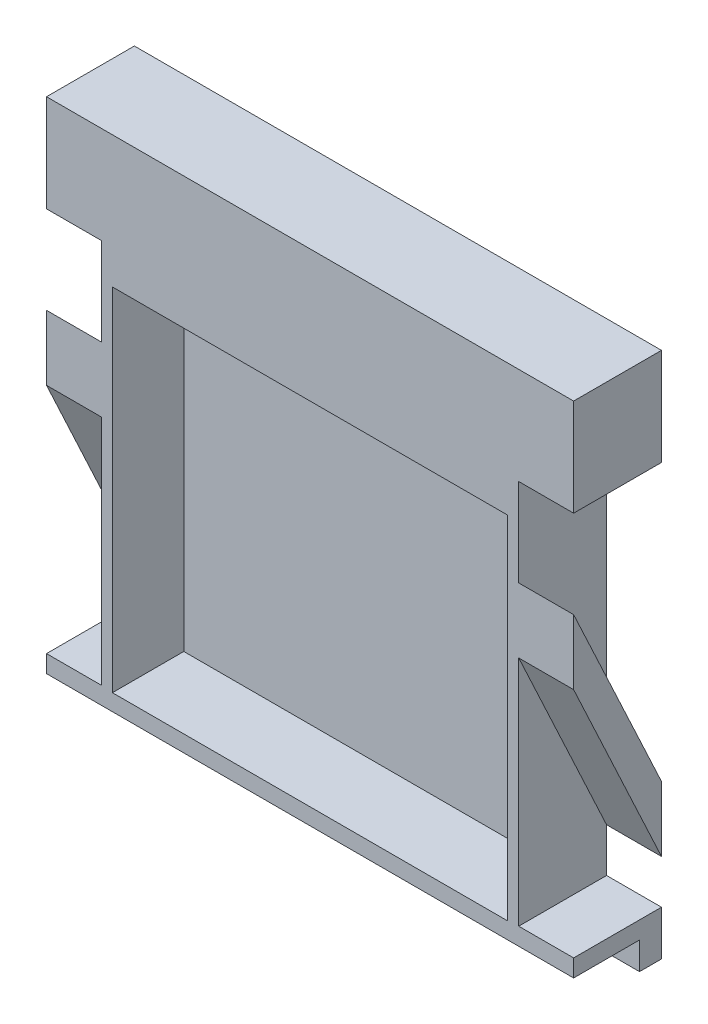
ISO-10303-21;
HEADER;
FILE_DESCRIPTION(('STEP AP214'),'2;1');
FILE_NAME('part.step','',(''),(''),'','','');
FILE_SCHEMA(('AUTOMOTIVE_DESIGN { 1 0 10303 214 1 1 1 1 }'));
ENDSEC;
DATA;
#1=APPLICATION_CONTEXT('core data for automotive mechanical design processes');
#2=APPLICATION_PROTOCOL_DEFINITION('international standard','automotive_design',2000,#1);
#3=PRODUCT_CONTEXT('',#1,'mechanical');
#4=PRODUCT('Part','Part','',(#3));
#5=PRODUCT_RELATED_PRODUCT_CATEGORY('part','',(#4));
#6=PRODUCT_DEFINITION_FORMATION('','',#4);
#7=PRODUCT_DEFINITION_CONTEXT('part definition',#1,'design');
#8=PRODUCT_DEFINITION('design','',#6,#7);
#9=PRODUCT_DEFINITION_SHAPE('','',#8);
#10=(LENGTH_UNIT() NAMED_UNIT(*) SI_UNIT(.MILLI.,.METRE.));
#11=(NAMED_UNIT(*) PLANE_ANGLE_UNIT() SI_UNIT($,.RADIAN.));
#12=(NAMED_UNIT(*) SI_UNIT($,.STERADIAN.) SOLID_ANGLE_UNIT());
#13=UNCERTAINTY_MEASURE_WITH_UNIT(LENGTH_MEASURE(1.E-05),#10,'distance_accuracy_value','');
#14=(GEOMETRIC_REPRESENTATION_CONTEXT(3) GLOBAL_UNCERTAINTY_ASSIGNED_CONTEXT((#13)) GLOBAL_UNIT_ASSIGNED_CONTEXT((#10,
#11,#12)) REPRESENTATION_CONTEXT('',''));
#15=CARTESIAN_POINT('',(0.,0.,0.));
#16=DIRECTION('',(0.,0.,1.));
#17=DIRECTION('',(1.,0.,0.));
#18=AXIS2_PLACEMENT_3D('',#15,#16,#17);
#19=CARTESIAN_POINT('',(-152.4,-152.4,50.8));
#20=DIRECTION('',(1.,0.,0.));
#21=DIRECTION('',(0.,0.,-1.));
#22=AXIS2_PLACEMENT_3D('',#19,#20,#21);
#23=PLANE('',#22);
#24=DIRECTION('',(0.,0.,-1.));
#25=VECTOR('',#24,1.);
#26=CARTESIAN_POINT('',(-152.4,-126.463450132546,0.));
#27=LINE('',#26,#25);
#28=CARTESIAN_POINT('',(-152.4,-126.463450132546,50.8));
#29=VERTEX_POINT('',#28);
#30=CARTESIAN_POINT('',(-152.4,-126.463450132546,0.));
#31=VERTEX_POINT('',#30);
#32=EDGE_CURVE('E223',#29,#31,#27,.T.);
#33=ORIENTED_EDGE('',*,*,#32,.T.);
#34=DIRECTION('',(0.,-1.,0.));
#35=VECTOR('',#34,1.);
#36=CARTESIAN_POINT('',(-152.4,-152.4,0.));
#37=LINE('',#36,#35);
#38=CARTESIAN_POINT('',(-152.4,-152.4,0.));
#39=VERTEX_POINT('',#38);
#40=EDGE_CURVE('E384',#31,#39,#37,.T.);
#41=ORIENTED_EDGE('',*,*,#40,.T.);
#42=DIRECTION('',(0.,0.,-1.));
#43=VECTOR('',#42,1.);
#44=CARTESIAN_POINT('',(-152.4,-152.4,50.8));
#45=LINE('',#44,#43);
#46=CARTESIAN_POINT('',(-152.4,-152.4,12.7));
#47=VERTEX_POINT('',#46);
#48=EDGE_CURVE('E11',#47,#39,#45,.T.);
#49=ORIENTED_EDGE('',*,*,#48,.F.);
#50=DIRECTION('',(0.,-1.,0.));
#51=VECTOR('',#50,1.);
#52=CARTESIAN_POINT('',(-152.4,-152.4,12.7));
#53=LINE('',#52,#51);
#54=CARTESIAN_POINT('',(-152.4,-136.525,12.7));
#55=VERTEX_POINT('',#54);
#56=EDGE_CURVE('E342',#55,#47,#53,.T.);
#57=ORIENTED_EDGE('',*,*,#56,.F.);
#58=DIRECTION('',(0.,0.,1.));
#59=VECTOR('',#58,1.);
#60=CARTESIAN_POINT('',(-152.4,-136.525,12.7));
#61=LINE('',#60,#59);
#62=CARTESIAN_POINT('',(-152.4,-136.525,50.8));
#63=VERTEX_POINT('',#62);
#64=EDGE_CURVE('E354',#55,#63,#61,.T.);
#65=ORIENTED_EDGE('',*,*,#64,.T.);
#66=DIRECTION('',(0.,-1.,0.));
#67=VECTOR('',#66,1.);
#68=CARTESIAN_POINT('',(-152.4,-152.4,50.8));
#69=LINE('',#68,#67);
#70=EDGE_CURVE('E395',#29,#63,#69,.T.);
#71=ORIENTED_EDGE('',*,*,#70,.F.);
#72=EDGE_LOOP('',(#33,#41,#49,#57,#65,#71));
#73=FACE_BOUND('',#72,.T.);
#74=ADVANCED_FACE('F35',(#73),#23,.F.);
#75=DIRECTION('',(0.,0.906307787036648,0.422618261740704));
#76=VECTOR('',#75,1.);
#77=CARTESIAN_POINT('',(-152.4,7.87750142933856,50.8));
#78=LINE('',#77,#76);
#79=CARTESIAN_POINT('',(-152.4,-101.063450132546,0.));
#80=VERTEX_POINT('',#79);
#81=CARTESIAN_POINT('',(-152.4,7.87750142933856,50.8));
#82=VERTEX_POINT('',#81);
#83=EDGE_CURVE('E507',#80,#82,#78,.T.);
#84=ORIENTED_EDGE('',*,*,#83,.T.);
#85=CARTESIAN_POINT('',(-152.4,45.440951561884,50.8));
#86=VERTEX_POINT('',#85);
#87=EDGE_CURVE('E229',#86,#82,#69,.T.);
#88=ORIENTED_EDGE('',*,*,#87,.F.);
#89=DIRECTION('',(0.,-0.906307787036648,-0.422618261740704));
#90=VECTOR('',#89,1.);
#91=CARTESIAN_POINT('',(-152.4,45.440951561884,50.8));
#92=LINE('',#91,#90);
#93=CARTESIAN_POINT('',(-152.4,-63.5000000000001,0.));
#94=VERTEX_POINT('',#93);
#95=EDGE_CURVE('E239',#86,#94,#92,.T.);
#96=ORIENTED_EDGE('',*,*,#95,.T.);
#97=EDGE_CURVE('E407',#94,#80,#37,.T.);
#98=ORIENTED_EDGE('',*,*,#97,.T.);
#99=EDGE_LOOP('',(#84,#88,#96,#98));
#100=FACE_BOUND('',#99,.T.);
#101=ADVANCED_FACE('F470',(#100),#23,.F.);
#102=CARTESIAN_POINT('',(-152.4,152.4,50.8));
#103=DIRECTION('',(0.,0.,-1.));
#104=DIRECTION('',(-1.,0.,0.));
#105=AXIS2_PLACEMENT_3D('',#102,#103,#104);
#106=PLANE('',#105);
#107=DIRECTION('',(-1.,0.,0.));
#108=VECTOR('',#107,1.);
#109=CARTESIAN_POINT('',(114.3,76.2,50.8));
#110=LINE('',#109,#108);
#111=CARTESIAN_POINT('',(114.3,76.2,50.8));
#112=VERTEX_POINT('',#111);
#113=CARTESIAN_POINT('',(-114.3,76.2,50.8));
#114=VERTEX_POINT('',#113);
#115=EDGE_CURVE('E374',#112,#114,#110,.T.);
#116=ORIENTED_EDGE('',*,*,#115,.F.);
#117=DIRECTION('',(0.,1.,0.));
#118=VECTOR('',#117,1.);
#119=CARTESIAN_POINT('',(114.3,-127.,50.8));
#120=LINE('',#119,#118);
#121=CARTESIAN_POINT('',(114.3,-127.,50.8));
#122=VERTEX_POINT('',#121);
#123=EDGE_CURVE('E357',#122,#112,#120,.T.);
#124=ORIENTED_EDGE('',*,*,#123,.F.);
#125=DIRECTION('',(1.,0.,0.));
#126=VECTOR('',#125,1.);
#127=CARTESIAN_POINT('',(114.3,-127.,50.8));
#128=LINE('',#127,#126);
#129=CARTESIAN_POINT('',(-114.3,-127.,50.8));
#130=VERTEX_POINT('',#129);
#131=EDGE_CURVE('E363',#130,#122,#128,.T.);
#132=ORIENTED_EDGE('',*,*,#131,.F.);
#133=DIRECTION('',(0.,-1.,0.));
#134=VECTOR('',#133,1.);
#135=CARTESIAN_POINT('',(-114.3,-127.,50.8));
#136=LINE('',#135,#134);
#137=EDGE_CURVE('E377',#114,#130,#136,.T.);
#138=ORIENTED_EDGE('',*,*,#137,.F.);
#139=EDGE_LOOP('',(#116,#124,#132,#138));
#140=FACE_BOUND('',#139,.T.);
#141=DIRECTION('',(-1.,0.,0.));
#142=VECTOR('',#141,1.);
#143=CARTESIAN_POINT('',(-120.65,-126.463450132546,50.8));
#144=LINE('',#143,#142);
#145=CARTESIAN_POINT('',(-120.65,-126.463450132546,50.8));
#146=VERTEX_POINT('',#145);
#147=EDGE_CURVE('E250',#146,#29,#144,.T.);
#148=ORIENTED_EDGE('',*,*,#147,.T.);
#149=ORIENTED_EDGE('',*,*,#70,.T.);
#150=DIRECTION('',(-1.,0.,0.));
#151=VECTOR('',#150,1.);
#152=CARTESIAN_POINT('',(-152.4,-136.525,50.8));
#153=LINE('',#152,#151);
#154=CARTESIAN_POINT('',(152.4,-136.525,50.8));
#155=VERTEX_POINT('',#154);
#156=EDGE_CURVE('E339',#155,#63,#153,.T.);
#157=ORIENTED_EDGE('',*,*,#156,.F.);
#158=DIRECTION('',(0.,1.,0.));
#159=VECTOR('',#158,1.);
#160=CARTESIAN_POINT('',(152.4,-152.4,50.8));
#161=LINE('',#160,#159);
#162=CARTESIAN_POINT('',(152.4,-126.463450132546,50.8));
#163=VERTEX_POINT('',#162);
#164=EDGE_CURVE('E396',#155,#163,#161,.T.);
#165=ORIENTED_EDGE('',*,*,#164,.T.);
#166=DIRECTION('',(1.,0.,0.));
#167=VECTOR('',#166,1.);
#168=CARTESIAN_POINT('',(120.65,-126.463450132546,50.8));
#169=LINE('',#168,#167);
#170=CARTESIAN_POINT('',(120.65,-126.463450132546,50.8));
#171=VERTEX_POINT('',#170);
#172=EDGE_CURVE('E273',#171,#163,#169,.T.);
#173=ORIENTED_EDGE('',*,*,#172,.F.);
#174=DIRECTION('',(0.,-1.,0.));
#175=VECTOR('',#174,1.);
#176=CARTESIAN_POINT('',(120.65,-126.463450132546,50.8));
#177=LINE('',#176,#175);
#178=CARTESIAN_POINT('',(120.65,7.87750142933856,50.8));
#179=VERTEX_POINT('',#178);
#180=EDGE_CURVE('E262',#179,#171,#177,.T.);
#181=ORIENTED_EDGE('',*,*,#180,.F.);
#182=DIRECTION('',(1.,0.,0.));
#183=VECTOR('',#182,1.);
#184=CARTESIAN_POINT('',(120.65,7.87750142933856,50.8));
#185=LINE('',#184,#183);
#186=CARTESIAN_POINT('',(152.4,7.87750142933856,50.8));
#187=VERTEX_POINT('',#186);
#188=EDGE_CURVE('E276',#179,#187,#185,.T.);
#189=ORIENTED_EDGE('',*,*,#188,.T.);
#190=CARTESIAN_POINT('',(152.4,45.440951561884,50.8));
#191=VERTEX_POINT('',#190);
#192=EDGE_CURVE('E400',#187,#191,#161,.T.);
#193=ORIENTED_EDGE('',*,*,#192,.T.);
#194=DIRECTION('',(1.,0.,0.));
#195=VECTOR('',#194,1.);
#196=CARTESIAN_POINT('',(120.65,45.440951561884,50.8));
#197=LINE('',#196,#195);
#198=CARTESIAN_POINT('',(120.65,45.440951561884,50.8));
#199=VERTEX_POINT('',#198);
#200=EDGE_CURVE('E297',#199,#191,#197,.T.);
#201=ORIENTED_EDGE('',*,*,#200,.F.);
#202=DIRECTION('',(0.,-1.,0.));
#203=VECTOR('',#202,1.);
#204=CARTESIAN_POINT('',(120.65,96.240951561884,50.8));
#205=LINE('',#204,#203);
#206=CARTESIAN_POINT('',(120.65,96.240951561884,50.8));
#207=VERTEX_POINT('',#206);
#208=EDGE_CURVE('E286',#207,#199,#205,.T.);
#209=ORIENTED_EDGE('',*,*,#208,.F.);
#210=DIRECTION('',(1.,0.,0.));
#211=VECTOR('',#210,1.);
#212=CARTESIAN_POINT('',(120.65,96.240951561884,50.8));
#213=LINE('',#212,#211);
#214=CARTESIAN_POINT('',(152.4,96.240951561884,50.8));
#215=VERTEX_POINT('',#214);
#216=EDGE_CURVE('E301',#207,#215,#213,.T.);
#217=ORIENTED_EDGE('',*,*,#216,.T.);
#218=CARTESIAN_POINT('',(152.4,152.4,50.8));
#219=VERTEX_POINT('',#218);
#220=EDGE_CURVE('E394',#215,#219,#161,.T.);
#221=ORIENTED_EDGE('',*,*,#220,.T.);
#222=DIRECTION('',(-1.,0.,0.));
#223=VECTOR('',#222,1.);
#224=CARTESIAN_POINT('',(-152.4,152.4,50.8));
#225=LINE('',#224,#223);
#226=CARTESIAN_POINT('',(-152.4,152.4,50.8));
#227=VERTEX_POINT('',#226);
#228=EDGE_CURVE('E399',#219,#227,#225,.T.);
#229=ORIENTED_EDGE('',*,*,#228,.T.);
#230=CARTESIAN_POINT('',(-152.4,96.240951561884,50.8));
#231=VERTEX_POINT('',#230);
#232=EDGE_CURVE('E391',#227,#231,#69,.T.);
#233=ORIENTED_EDGE('',*,*,#232,.T.);
#234=DIRECTION('',(-1.,0.,0.));
#235=VECTOR('',#234,1.);
#236=CARTESIAN_POINT('',(-120.65,96.240951561884,50.8));
#237=LINE('',#236,#235);
#238=CARTESIAN_POINT('',(-120.65,96.240951561884,50.8));
#239=VERTEX_POINT('',#238);
#240=EDGE_CURVE('E246',#239,#231,#237,.T.);
#241=ORIENTED_EDGE('',*,*,#240,.F.);
#242=DIRECTION('',(0.,-1.,0.));
#243=VECTOR('',#242,1.);
#244=CARTESIAN_POINT('',(-120.65,96.240951561884,50.8));
#245=LINE('',#244,#243);
#246=CARTESIAN_POINT('',(-120.65,45.440951561884,50.8));
#247=VERTEX_POINT('',#246);
#248=EDGE_CURVE('E236',#239,#247,#245,.T.);
#249=ORIENTED_EDGE('',*,*,#248,.T.);
#250=DIRECTION('',(-1.,0.,0.));
#251=VECTOR('',#250,1.);
#252=CARTESIAN_POINT('',(-120.65,45.440951561884,50.8));
#253=LINE('',#252,#251);
#254=EDGE_CURVE('E253',#247,#86,#253,.T.);
#255=ORIENTED_EDGE('',*,*,#254,.T.);
#256=ORIENTED_EDGE('',*,*,#87,.T.);
#257=DIRECTION('',(-1.,0.,0.));
#258=VECTOR('',#257,1.);
#259=CARTESIAN_POINT('',(-120.65,7.87750142933856,50.8));
#260=LINE('',#259,#258);
#261=CARTESIAN_POINT('',(-120.65,7.87750142933856,50.8));
#262=VERTEX_POINT('',#261);
#263=EDGE_CURVE('E209',#262,#82,#260,.T.);
#264=ORIENTED_EDGE('',*,*,#263,.F.);
#265=DIRECTION('',(0.,-1.,0.));
#266=VECTOR('',#265,1.);
#267=CARTESIAN_POINT('',(-120.65,-126.463450132546,50.8));
#268=LINE('',#267,#266);
#269=EDGE_CURVE('E215',#262,#146,#268,.T.);
#270=ORIENTED_EDGE('',*,*,#269,.T.);
#271=EDGE_LOOP('',(#148,#149,#157,#165,#173,#181,#189,#193,#201,#209,#217,#221,#229,#233,#241,
#249,#255,#256,#264,#270));
#272=FACE_BOUND('',#271,.T.);
#273=ADVANCED_FACE('F226',(#140,#272),#106,.F.);
#274=CARTESIAN_POINT('',(-152.4,152.4,0.));
#275=DIRECTION('',(0.,0.,-1.));
#276=DIRECTION('',(-1.,0.,0.));
#277=AXIS2_PLACEMENT_3D('',#274,#275,#276);
#278=PLANE('',#277);
#279=CARTESIAN_POINT('',(63.5,-146.05,0.));
#280=DIRECTION('',(0.,0.,1.));
#281=DIRECTION('',(1.,0.,0.));
#282=AXIS2_PLACEMENT_3D('',#279,#280,#281);
#283=CIRCLE('',#282,3.302);
#284=CARTESIAN_POINT('',(66.802,-146.05,0.));
#285=VERTEX_POINT('',#284);
#286=EDGE_CURVE('E312',#285,#285,#283,.T.);
#287=ORIENTED_EDGE('',*,*,#286,.T.);
#288=EDGE_LOOP('',(#287));
#289=FACE_BOUND('',#288,.T.);
#290=CARTESIAN_POINT('',(0.,-146.05,0.));
#291=DIRECTION('',(0.,0.,1.));
#292=DIRECTION('',(1.,0.,0.));
#293=AXIS2_PLACEMENT_3D('',#290,#291,#292);
#294=CIRCLE('',#293,3.302);
#295=CARTESIAN_POINT('',(3.302,-146.05,0.));
#296=VERTEX_POINT('',#295);
#297=EDGE_CURVE('E318',#296,#296,#294,.T.);
#298=ORIENTED_EDGE('',*,*,#297,.T.);
#299=EDGE_LOOP('',(#298));
#300=FACE_BOUND('',#299,.T.);
#301=CARTESIAN_POINT('',(-63.5,-146.05,0.));
#302=DIRECTION('',(0.,0.,1.));
#303=DIRECTION('',(1.,0.,0.));
#304=AXIS2_PLACEMENT_3D('',#301,#302,#303);
#305=CIRCLE('',#304,3.302);
#306=CARTESIAN_POINT('',(-60.198,-146.05,0.));
#307=VERTEX_POINT('',#306);
#308=EDGE_CURVE('E324',#307,#307,#305,.T.);
#309=ORIENTED_EDGE('',*,*,#308,.T.);
#310=EDGE_LOOP('',(#309));
#311=FACE_BOUND('',#310,.T.);
#312=CARTESIAN_POINT('',(127.,-146.05,0.));
#313=DIRECTION('',(0.,0.,1.));
#314=DIRECTION('',(1.,0.,0.));
#315=AXIS2_PLACEMENT_3D('',#312,#313,#314);
#316=CIRCLE('',#315,3.30200000000001);
#317=CARTESIAN_POINT('',(130.302,-146.05,0.));
#318=VERTEX_POINT('',#317);
#319=EDGE_CURVE('E330',#318,#318,#316,.T.);
#320=ORIENTED_EDGE('',*,*,#319,.T.);
#321=EDGE_LOOP('',(#320));
#322=FACE_BOUND('',#321,.T.);
#323=CARTESIAN_POINT('',(-127.,-146.05,0.));
#324=DIRECTION('',(0.,0.,1.));
#325=DIRECTION('',(1.,0.,0.));
#326=AXIS2_PLACEMENT_3D('',#323,#324,#325);
#327=CIRCLE('',#326,3.302);
#328=CARTESIAN_POINT('',(-123.698,-146.05,0.));
#329=VERTEX_POINT('',#328);
#330=EDGE_CURVE('E336',#329,#329,#327,.T.);
#331=ORIENTED_EDGE('',*,*,#330,.T.);
#332=EDGE_LOOP('',(#331));
#333=FACE_BOUND('',#332,.T.);
#334=ORIENTED_EDGE('',*,*,#40,.F.);
#335=DIRECTION('',(-1.,0.,0.));
#336=VECTOR('',#335,1.);
#337=CARTESIAN_POINT('',(-120.65,-126.463450132546,0.));
#338=LINE('',#337,#336);
#339=CARTESIAN_POINT('',(-120.65,-126.463450132546,0.));
#340=VERTEX_POINT('',#339);
#341=EDGE_CURVE('E231',#340,#31,#338,.T.);
#342=ORIENTED_EDGE('',*,*,#341,.F.);
#343=DIRECTION('',(0.,1.,0.));
#344=VECTOR('',#343,1.);
#345=CARTESIAN_POINT('',(-120.65,-101.063450132546,0.));
#346=LINE('',#345,#344);
#347=CARTESIAN_POINT('',(-120.65,-101.063450132546,0.));
#348=VERTEX_POINT('',#347);
#349=EDGE_CURVE('E214',#340,#348,#346,.T.);
#350=ORIENTED_EDGE('',*,*,#349,.T.);
#351=DIRECTION('',(-1.,0.,0.));
#352=VECTOR('',#351,1.);
#353=CARTESIAN_POINT('',(-120.65,-101.063450132546,0.));
#354=LINE('',#353,#352);
#355=EDGE_CURVE('E212',#348,#80,#354,.T.);
#356=ORIENTED_EDGE('',*,*,#355,.T.);
#357=ORIENTED_EDGE('',*,*,#97,.F.);
#358=DIRECTION('',(-1.,0.,0.));
#359=VECTOR('',#358,1.);
#360=CARTESIAN_POINT('',(-120.65,-63.5000000000001,0.));
#361=LINE('',#360,#359);
#362=CARTESIAN_POINT('',(-120.65,-63.5000000000001,0.));
#363=VERTEX_POINT('',#362);
#364=EDGE_CURVE('E256',#363,#94,#361,.T.);
#365=ORIENTED_EDGE('',*,*,#364,.F.);
#366=DIRECTION('',(0.,1.,0.));
#367=VECTOR('',#366,1.);
#368=CARTESIAN_POINT('',(-120.65,-63.5000000000001,0.));
#369=LINE('',#368,#367);
#370=CARTESIAN_POINT('',(-120.65,96.240951561884,0.));
#371=VERTEX_POINT('',#370);
#372=EDGE_CURVE('E241',#363,#371,#369,.T.);
#373=ORIENTED_EDGE('',*,*,#372,.T.);
#374=DIRECTION('',(-1.,0.,0.));
#375=VECTOR('',#374,1.);
#376=CARTESIAN_POINT('',(-120.65,96.240951561884,0.));
#377=LINE('',#376,#375);
#378=CARTESIAN_POINT('',(-152.4,96.240951561884,0.));
#379=VERTEX_POINT('',#378);
#380=EDGE_CURVE('E258',#371,#379,#377,.T.);
#381=ORIENTED_EDGE('',*,*,#380,.T.);
#382=CARTESIAN_POINT('',(-152.4,152.4,0.));
#383=VERTEX_POINT('',#382);
#384=EDGE_CURVE('E403',#383,#379,#37,.T.);
#385=ORIENTED_EDGE('',*,*,#384,.F.);
#386=DIRECTION('',(-1.,0.,0.));
#387=VECTOR('',#386,1.);
#388=CARTESIAN_POINT('',(-152.4,152.4,0.));
#389=LINE('',#388,#387);
#390=CARTESIAN_POINT('',(152.4,152.4,0.));
#391=VERTEX_POINT('',#390);
#392=EDGE_CURVE('E414',#391,#383,#389,.T.);
#393=ORIENTED_EDGE('',*,*,#392,.F.);
#394=DIRECTION('',(0.,1.,0.));
#395=VECTOR('',#394,1.);
#396=CARTESIAN_POINT('',(152.4,-152.4,0.));
#397=LINE('',#396,#395);
#398=CARTESIAN_POINT('',(152.4,96.240951561884,0.));
#399=VERTEX_POINT('',#398);
#400=EDGE_CURVE('E410',#399,#391,#397,.T.);
#401=ORIENTED_EDGE('',*,*,#400,.F.);
#402=DIRECTION('',(1.,0.,0.));
#403=VECTOR('',#402,1.);
#404=CARTESIAN_POINT('',(120.65,96.240951561884,0.));
#405=LINE('',#404,#403);
#406=CARTESIAN_POINT('',(120.65,96.240951561884,0.));
#407=VERTEX_POINT('',#406);
#408=EDGE_CURVE('E305',#407,#399,#405,.T.);
#409=ORIENTED_EDGE('',*,*,#408,.F.);
#410=DIRECTION('',(0.,1.,0.));
#411=VECTOR('',#410,1.);
#412=CARTESIAN_POINT('',(120.65,-63.5000000000001,0.));
#413=LINE('',#412,#411);
#414=CARTESIAN_POINT('',(120.65,-63.5000000000001,0.));
#415=VERTEX_POINT('',#414);
#416=EDGE_CURVE('E292',#415,#407,#413,.T.);
#417=ORIENTED_EDGE('',*,*,#416,.F.);
#418=DIRECTION('',(1.,0.,0.));
#419=VECTOR('',#418,1.);
#420=CARTESIAN_POINT('',(120.65,-63.5000000000001,0.));
#421=LINE('',#420,#419);
#422=CARTESIAN_POINT('',(152.4,-63.5000000000001,0.));
#423=VERTEX_POINT('',#422);
#424=EDGE_CURVE('E307',#415,#423,#421,.T.);
#425=ORIENTED_EDGE('',*,*,#424,.T.);
#426=CARTESIAN_POINT('',(152.4,-101.063450132546,0.));
#427=VERTEX_POINT('',#426);
#428=EDGE_CURVE('E415',#427,#423,#397,.T.);
#429=ORIENTED_EDGE('',*,*,#428,.F.);
#430=DIRECTION('',(1.,0.,0.));
#431=VECTOR('',#430,1.);
#432=CARTESIAN_POINT('',(120.65,-101.063450132546,0.));
#433=LINE('',#432,#431);
#434=CARTESIAN_POINT('',(120.65,-101.063450132546,0.));
#435=VERTEX_POINT('',#434);
#436=EDGE_CURVE('E280',#435,#427,#433,.T.);
#437=ORIENTED_EDGE('',*,*,#436,.F.);
#438=DIRECTION('',(0.,1.,0.));
#439=VECTOR('',#438,1.);
#440=CARTESIAN_POINT('',(120.65,-101.063450132546,0.));
#441=LINE('',#440,#439);
#442=CARTESIAN_POINT('',(120.65,-126.463450132546,0.));
#443=VERTEX_POINT('',#442);
#444=EDGE_CURVE('E268',#443,#435,#441,.T.);
#445=ORIENTED_EDGE('',*,*,#444,.F.);
#446=DIRECTION('',(1.,0.,0.));
#447=VECTOR('',#446,1.);
#448=CARTESIAN_POINT('',(120.65,-126.463450132546,0.));
#449=LINE('',#448,#447);
#450=CARTESIAN_POINT('',(152.4,-126.463450132546,0.));
#451=VERTEX_POINT('',#450);
#452=EDGE_CURVE('E282',#443,#451,#449,.T.);
#453=ORIENTED_EDGE('',*,*,#452,.T.);
#454=CARTESIAN_POINT('',(152.4,-152.4,0.));
#455=VERTEX_POINT('',#454);
#456=EDGE_CURVE('E411',#455,#451,#397,.T.);
#457=ORIENTED_EDGE('',*,*,#456,.F.);
#458=DIRECTION('',(1.,0.,0.));
#459=VECTOR('',#458,1.);
#460=CARTESIAN_POINT('',(-152.4,-152.4,0.));
#461=LINE('',#460,#459);
#462=EDGE_CURVE('E406',#39,#455,#461,.T.);
#463=ORIENTED_EDGE('',*,*,#462,.F.);
#464=EDGE_LOOP('',(#334,#342,#350,#356,#357,#365,#373,#381,#385,#393,#401,#409,#417,#425,#429,
#437,#445,#453,#457,#463));
#465=FACE_BOUND('',#464,.T.);
#466=ADVANCED_FACE('F435',(#289,#300,#311,#322,#333,#465),#278,.T.);
#467=DIRECTION('',(0.,0.,1.));
#468=VECTOR('',#467,1.);
#469=CARTESIAN_POINT('',(-152.4,96.240951561884,0.));
#470=LINE('',#469,#468);
#471=EDGE_CURVE('E247',#379,#231,#470,.T.);
#472=ORIENTED_EDGE('',*,*,#471,.T.);
#473=ORIENTED_EDGE('',*,*,#232,.F.);
#474=DIRECTION('',(0.,0.,-1.));
#475=VECTOR('',#474,1.);
#476=CARTESIAN_POINT('',(-152.4,152.4,50.8));
#477=LINE('',#476,#475);
#478=EDGE_CURVE('E402',#227,#383,#477,.T.);
#479=ORIENTED_EDGE('',*,*,#478,.T.);
#480=ORIENTED_EDGE('',*,*,#384,.T.);
#481=EDGE_LOOP('',(#472,#473,#479,#480));
#482=FACE_BOUND('',#481,.T.);
#483=ADVANCED_FACE('F471',(#482),#23,.F.);
#484=CARTESIAN_POINT('',(152.4,-152.4,50.8));
#485=DIRECTION('',(-1.,0.,0.));
#486=DIRECTION('',(0.,0.,1.));
#487=AXIS2_PLACEMENT_3D('',#484,#485,#486);
#488=PLANE('',#487);
#489=ORIENTED_EDGE('',*,*,#192,.F.);
#490=DIRECTION('',(0.,0.906307787036648,0.422618261740704));
#491=VECTOR('',#490,1.);
#492=CARTESIAN_POINT('',(152.4,7.87750142933856,50.8));
#493=LINE('',#492,#491);
#494=EDGE_CURVE('E266',#427,#187,#493,.T.);
#495=ORIENTED_EDGE('',*,*,#494,.F.);
#496=ORIENTED_EDGE('',*,*,#428,.T.);
#497=DIRECTION('',(0.,-0.906307787036648,-0.422618261740704));
#498=VECTOR('',#497,1.);
#499=CARTESIAN_POINT('',(152.4,45.440951561884,50.8));
#500=LINE('',#499,#498);
#501=EDGE_CURVE('E279',#191,#423,#500,.T.);
#502=ORIENTED_EDGE('',*,*,#501,.F.);
#503=EDGE_LOOP('',(#489,#495,#496,#502));
#504=FACE_BOUND('',#503,.T.);
#505=ADVANCED_FACE('F477',(#504),#488,.F.);
#506=ORIENTED_EDGE('',*,*,#220,.F.);
#507=DIRECTION('',(0.,0.,1.));
#508=VECTOR('',#507,1.);
#509=CARTESIAN_POINT('',(152.4,96.240951561884,0.));
#510=LINE('',#509,#508);
#511=EDGE_CURVE('E290',#399,#215,#510,.T.);
#512=ORIENTED_EDGE('',*,*,#511,.F.);
#513=ORIENTED_EDGE('',*,*,#400,.T.);
#514=DIRECTION('',(0.,0.,-1.));
#515=VECTOR('',#514,1.);
#516=CARTESIAN_POINT('',(152.4,152.4,50.8));
#517=LINE('',#516,#515);
#518=EDGE_CURVE('E419',#219,#391,#517,.T.);
#519=ORIENTED_EDGE('',*,*,#518,.F.);
#520=EDGE_LOOP('',(#506,#512,#513,#519));
#521=FACE_BOUND('',#520,.T.);
#522=ADVANCED_FACE('F483',(#521),#488,.F.);
#523=CARTESIAN_POINT('',(-152.4,-152.4,50.8));
#524=DIRECTION('',(0.,1.,0.));
#525=DIRECTION('',(-1.,0.,0.));
#526=AXIS2_PLACEMENT_3D('',#523,#524,#525);
#527=PLANE('',#526);
#528=DIRECTION('',(0.,0.,-1.));
#529=VECTOR('',#528,1.);
#530=CARTESIAN_POINT('',(152.4,-152.4,50.8));
#531=LINE('',#530,#529);
#532=CARTESIAN_POINT('',(152.4,-152.4,12.7));
#533=VERTEX_POINT('',#532);
#534=EDGE_CURVE('E42',#533,#455,#531,.T.);
#535=ORIENTED_EDGE('',*,*,#534,.F.);
#536=DIRECTION('',(1.,0.,0.));
#537=VECTOR('',#536,1.);
#538=CARTESIAN_POINT('',(-152.4,-152.4,12.7));
#539=LINE('',#538,#537);
#540=EDGE_CURVE('E344',#47,#533,#539,.T.);
#541=ORIENTED_EDGE('',*,*,#540,.F.);
#542=ORIENTED_EDGE('',*,*,#48,.T.);
#543=ORIENTED_EDGE('',*,*,#462,.T.);
#544=EDGE_LOOP('',(#535,#541,#542,#543));
#545=FACE_BOUND('',#544,.T.);
#546=ADVANCED_FACE('F431',(#545),#527,.F.);
#547=ORIENTED_EDGE('',*,*,#456,.T.);
#548=DIRECTION('',(0.,0.,-1.));
#549=VECTOR('',#548,1.);
#550=CARTESIAN_POINT('',(152.4,-126.463450132546,0.));
#551=LINE('',#550,#549);
#552=EDGE_CURVE('E255',#163,#451,#551,.T.);
#553=ORIENTED_EDGE('',*,*,#552,.F.);
#554=ORIENTED_EDGE('',*,*,#164,.F.);
#555=DIRECTION('',(0.,0.,1.));
#556=VECTOR('',#555,1.);
#557=CARTESIAN_POINT('',(152.4,-136.525,12.7));
#558=LINE('',#557,#556);
#559=CARTESIAN_POINT('',(152.4,-136.525,12.7));
#560=VERTEX_POINT('',#559);
#561=EDGE_CURVE('E351',#560,#155,#558,.T.);
#562=ORIENTED_EDGE('',*,*,#561,.F.);
#563=DIRECTION('',(0.,1.,0.));
#564=VECTOR('',#563,1.);
#565=CARTESIAN_POINT('',(152.4,-152.4,12.7));
#566=LINE('',#565,#564);
#567=EDGE_CURVE('E346',#533,#560,#566,.T.);
#568=ORIENTED_EDGE('',*,*,#567,.F.);
#569=ORIENTED_EDGE('',*,*,#534,.T.);
#570=EDGE_LOOP('',(#547,#553,#554,#562,#568,#569));
#571=FACE_BOUND('',#570,.T.);
#572=ADVANCED_FACE('F424',(#571),#488,.F.);
#573=CARTESIAN_POINT('',(-152.4,152.4,50.8));
#574=DIRECTION('',(0.,-1.,0.));
#575=DIRECTION('',(1.,0.,0.));
#576=AXIS2_PLACEMENT_3D('',#573,#574,#575);
#577=PLANE('',#576);
#578=ORIENTED_EDGE('',*,*,#392,.T.);
#579=ORIENTED_EDGE('',*,*,#478,.F.);
#580=ORIENTED_EDGE('',*,*,#228,.F.);
#581=ORIENTED_EDGE('',*,*,#518,.T.);
#582=EDGE_LOOP('',(#578,#579,#580,#581));
#583=FACE_BOUND('',#582,.T.);
#584=ADVANCED_FACE('F497',(#583),#577,.F.);
#585=CARTESIAN_POINT('',(114.3,-127.,9.525));
#586=DIRECTION('',(1.,0.,0.));
#587=DIRECTION('',(0.,0.,-1.));
#588=AXIS2_PLACEMENT_3D('',#585,#586,#587);
#589=PLANE('',#588);
#590=ORIENTED_EDGE('',*,*,#123,.T.);
#591=DIRECTION('',(0.,0.,1.));
#592=VECTOR('',#591,1.);
#593=CARTESIAN_POINT('',(114.3,76.2,9.525));
#594=LINE('',#593,#592);
#595=CARTESIAN_POINT('',(114.3,76.2,9.525));
#596=VERTEX_POINT('',#595);
#597=EDGE_CURVE('E372',#596,#112,#594,.T.);
#598=ORIENTED_EDGE('',*,*,#597,.F.);
#599=DIRECTION('',(0.,1.,0.));
#600=VECTOR('',#599,1.);
#601=CARTESIAN_POINT('',(114.3,-127.,9.525));
#602=LINE('',#601,#600);
#603=CARTESIAN_POINT('',(114.3,-127.,9.525));
#604=VERTEX_POINT('',#603);
#605=EDGE_CURVE('E359',#604,#596,#602,.T.);
#606=ORIENTED_EDGE('',*,*,#605,.F.);
#607=DIRECTION('',(0.,0.,1.));
#608=VECTOR('',#607,1.);
#609=CARTESIAN_POINT('',(114.3,-127.,9.525));
#610=LINE('',#609,#608);
#611=EDGE_CURVE('E382',#604,#122,#610,.T.);
#612=ORIENTED_EDGE('',*,*,#611,.T.);
#613=EDGE_LOOP('',(#590,#598,#606,#612));
#614=FACE_BOUND('',#613,.T.);
#615=ADVANCED_FACE('F688',(#614),#589,.F.);
#616=CARTESIAN_POINT('',(114.3,-127.,9.525));
#617=DIRECTION('',(0.,-1.,0.));
#618=DIRECTION('',(0.,0.,-1.));
#619=AXIS2_PLACEMENT_3D('',#616,#617,#618);
#620=PLANE('',#619);
#621=ORIENTED_EDGE('',*,*,#131,.T.);
#622=ORIENTED_EDGE('',*,*,#611,.F.);
#623=DIRECTION('',(1.,0.,0.));
#624=VECTOR('',#623,1.);
#625=CARTESIAN_POINT('',(114.3,-127.,9.525));
#626=LINE('',#625,#624);
#627=CARTESIAN_POINT('',(-114.3,-127.,9.525));
#628=VERTEX_POINT('',#627);
#629=EDGE_CURVE('E369',#628,#604,#626,.T.);
#630=ORIENTED_EDGE('',*,*,#629,.F.);
#631=DIRECTION('',(0.,0.,1.));
#632=VECTOR('',#631,1.);
#633=CARTESIAN_POINT('',(-114.3,-127.,9.525));
#634=LINE('',#633,#632);
#635=EDGE_CURVE('E385',#628,#130,#634,.T.);
#636=ORIENTED_EDGE('',*,*,#635,.T.);
#637=EDGE_LOOP('',(#621,#622,#630,#636));
#638=FACE_BOUND('',#637,.T.);
#639=ADVANCED_FACE('F775',(#638),#620,.F.);
#640=CARTESIAN_POINT('',(-114.3,-127.,9.525));
#641=DIRECTION('',(-1.,0.,0.));
#642=DIRECTION('',(0.,-1.,0.));
#643=AXIS2_PLACEMENT_3D('',#640,#641,#642);
#644=PLANE('',#643);
#645=ORIENTED_EDGE('',*,*,#137,.T.);
#646=ORIENTED_EDGE('',*,*,#635,.F.);
#647=DIRECTION('',(0.,-1.,0.));
#648=VECTOR('',#647,1.);
#649=CARTESIAN_POINT('',(-114.3,-127.,9.525));
#650=LINE('',#649,#648);
#651=CARTESIAN_POINT('',(-114.3,76.2,9.525));
#652=VERTEX_POINT('',#651);
#653=EDGE_CURVE('E366',#652,#628,#650,.T.);
#654=ORIENTED_EDGE('',*,*,#653,.F.);
#655=DIRECTION('',(0.,0.,1.));
#656=VECTOR('',#655,1.);
#657=CARTESIAN_POINT('',(-114.3,76.2,9.525));
#658=LINE('',#657,#656);
#659=EDGE_CURVE('E387',#652,#114,#658,.T.);
#660=ORIENTED_EDGE('',*,*,#659,.T.);
#661=EDGE_LOOP('',(#645,#646,#654,#660));
#662=FACE_BOUND('',#661,.T.);
#663=ADVANCED_FACE('F767',(#662),#644,.F.);
#664=CARTESIAN_POINT('',(114.3,76.2,9.525));
#665=DIRECTION('',(0.,1.,0.));
#666=DIRECTION('',(-1.,0.,0.));
#667=AXIS2_PLACEMENT_3D('',#664,#665,#666);
#668=PLANE('',#667);
#669=ORIENTED_EDGE('',*,*,#115,.T.);
#670=ORIENTED_EDGE('',*,*,#659,.F.);
#671=DIRECTION('',(-1.,0.,0.));
#672=VECTOR('',#671,1.);
#673=CARTESIAN_POINT('',(114.3,76.2,9.525));
#674=LINE('',#673,#672);
#675=EDGE_CURVE('E362',#596,#652,#674,.T.);
#676=ORIENTED_EDGE('',*,*,#675,.F.);
#677=ORIENTED_EDGE('',*,*,#597,.T.);
#678=EDGE_LOOP('',(#669,#670,#676,#677));
#679=FACE_BOUND('',#678,.T.);
#680=ADVANCED_FACE('F758',(#679),#668,.F.);
#681=CARTESIAN_POINT('',(114.3,76.2,9.525));
#682=DIRECTION('',(0.,0.,1.));
#683=DIRECTION('',(1.,0.,0.));
#684=AXIS2_PLACEMENT_3D('',#681,#682,#683);
#685=PLANE('',#684);
#686=ORIENTED_EDGE('',*,*,#605,.T.);
#687=ORIENTED_EDGE('',*,*,#675,.T.);
#688=ORIENTED_EDGE('',*,*,#653,.T.);
#689=ORIENTED_EDGE('',*,*,#629,.T.);
#690=EDGE_LOOP('',(#686,#687,#688,#689));
#691=FACE_BOUND('',#690,.T.);
#692=ADVANCED_FACE('F465',(#691),#685,.T.);
#693=CARTESIAN_POINT('',(-152.4,-136.525,12.7));
#694=DIRECTION('',(0.,1.,0.));
#695=DIRECTION('',(-1.,0.,0.));
#696=AXIS2_PLACEMENT_3D('',#693,#694,#695);
#697=PLANE('',#696);
#698=ORIENTED_EDGE('',*,*,#156,.T.);
#699=ORIENTED_EDGE('',*,*,#64,.F.);
#700=DIRECTION('',(-1.,0.,0.));
#701=VECTOR('',#700,1.);
#702=CARTESIAN_POINT('',(-152.4,-136.525,12.7));
#703=LINE('',#702,#701);
#704=EDGE_CURVE('E348',#560,#55,#703,.T.);
#705=ORIENTED_EDGE('',*,*,#704,.F.);
#706=ORIENTED_EDGE('',*,*,#561,.T.);
#707=EDGE_LOOP('',(#698,#699,#705,#706));
#708=FACE_BOUND('',#707,.T.);
#709=ADVANCED_FACE('F447',(#708),#697,.F.);
#710=CARTESIAN_POINT('',(-152.4,-136.525,12.7));
#711=DIRECTION('',(0.,0.,-1.));
#712=DIRECTION('',(-1.,0.,0.));
#713=AXIS2_PLACEMENT_3D('',#710,#711,#712);
#714=PLANE('',#713);
#715=CARTESIAN_POINT('',(63.5,-146.05,12.7));
#716=DIRECTION('',(0.,0.,1.));
#717=DIRECTION('',(1.,0.,0.));
#718=AXIS2_PLACEMENT_3D('',#715,#716,#717);
#719=CIRCLE('',#718,3.302);
#720=CARTESIAN_POINT('',(66.802,-146.05,12.7));
#721=VERTEX_POINT('',#720);
#722=EDGE_CURVE('E304',#721,#721,#719,.T.);
#723=ORIENTED_EDGE('',*,*,#722,.F.);
#724=EDGE_LOOP('',(#723));
#725=FACE_BOUND('',#724,.T.);
#726=CARTESIAN_POINT('',(0.,-146.05,12.7));
#727=DIRECTION('',(0.,0.,1.));
#728=DIRECTION('',(1.,0.,0.));
#729=AXIS2_PLACEMENT_3D('',#726,#727,#728);
#730=CIRCLE('',#729,3.302);
#731=CARTESIAN_POINT('',(3.302,-146.05,12.7));
#732=VERTEX_POINT('',#731);
#733=EDGE_CURVE('E315',#732,#732,#730,.T.);
#734=ORIENTED_EDGE('',*,*,#733,.F.);
#735=EDGE_LOOP('',(#734));
#736=FACE_BOUND('',#735,.T.);
#737=CARTESIAN_POINT('',(-63.5,-146.05,12.7));
#738=DIRECTION('',(0.,0.,1.));
#739=DIRECTION('',(1.,0.,0.));
#740=AXIS2_PLACEMENT_3D('',#737,#738,#739);
#741=CIRCLE('',#740,3.302);
#742=CARTESIAN_POINT('',(-60.198,-146.05,12.7));
#743=VERTEX_POINT('',#742);
#744=EDGE_CURVE('E321',#743,#743,#741,.T.);
#745=ORIENTED_EDGE('',*,*,#744,.F.);
#746=EDGE_LOOP('',(#745));
#747=FACE_BOUND('',#746,.T.);
#748=CARTESIAN_POINT('',(127.,-146.05,12.7));
#749=DIRECTION('',(0.,0.,1.));
#750=DIRECTION('',(1.,0.,0.));
#751=AXIS2_PLACEMENT_3D('',#748,#749,#750);
#752=CIRCLE('',#751,3.30200000000001);
#753=CARTESIAN_POINT('',(130.302,-146.05,12.7));
#754=VERTEX_POINT('',#753);
#755=EDGE_CURVE('E327',#754,#754,#752,.T.);
#756=ORIENTED_EDGE('',*,*,#755,.F.);
#757=EDGE_LOOP('',(#756));
#758=FACE_BOUND('',#757,.T.);
#759=CARTESIAN_POINT('',(-127.,-146.05,12.7));
#760=DIRECTION('',(0.,0.,1.));
#761=DIRECTION('',(1.,0.,0.));
#762=AXIS2_PLACEMENT_3D('',#759,#760,#761);
#763=CIRCLE('',#762,3.302);
#764=CARTESIAN_POINT('',(-123.698,-146.05,12.7));
#765=VERTEX_POINT('',#764);
#766=EDGE_CURVE('E333',#765,#765,#763,.T.);
#767=ORIENTED_EDGE('',*,*,#766,.F.);
#768=EDGE_LOOP('',(#767));
#769=FACE_BOUND('',#768,.T.);
#770=ORIENTED_EDGE('',*,*,#56,.T.);
#771=ORIENTED_EDGE('',*,*,#540,.T.);
#772=ORIENTED_EDGE('',*,*,#567,.T.);
#773=ORIENTED_EDGE('',*,*,#704,.T.);
#774=EDGE_LOOP('',(#770,#771,#772,#773));
#775=FACE_BOUND('',#774,.T.);
#776=ADVANCED_FACE('F453',(#725,#736,#747,#758,#769,#775),#714,.F.);
#777=CARTESIAN_POINT('',(-127.,-146.05,0.));
#778=DIRECTION('',(0.,0.,1.));
#779=DIRECTION('',(1.,0.,0.));
#780=AXIS2_PLACEMENT_3D('',#777,#778,#779);
#781=CYLINDRICAL_SURFACE('',#780,3.302);
#782=ORIENTED_EDGE('',*,*,#330,.F.);
#783=EDGE_LOOP('',(#782));
#784=FACE_BOUND('',#783,.T.);
#785=ORIENTED_EDGE('',*,*,#766,.T.);
#786=EDGE_LOOP('',(#785));
#787=FACE_BOUND('',#786,.T.);
#788=ADVANCED_FACE('F455',(#784,#787),#781,.F.);
#789=CARTESIAN_POINT('',(127.,-146.05,0.));
#790=DIRECTION('',(0.,0.,1.));
#791=DIRECTION('',(1.,0.,0.));
#792=AXIS2_PLACEMENT_3D('',#789,#790,#791);
#793=CYLINDRICAL_SURFACE('',#792,3.30200000000001);
#794=ORIENTED_EDGE('',*,*,#319,.F.);
#795=EDGE_LOOP('',(#794));
#796=FACE_BOUND('',#795,.T.);
#797=ORIENTED_EDGE('',*,*,#755,.T.);
#798=EDGE_LOOP('',(#797));
#799=FACE_BOUND('',#798,.T.);
#800=ADVANCED_FACE('F462',(#796,#799),#793,.F.);
#801=CARTESIAN_POINT('',(-63.5,-146.05,0.));
#802=DIRECTION('',(0.,0.,1.));
#803=DIRECTION('',(1.,0.,0.));
#804=AXIS2_PLACEMENT_3D('',#801,#802,#803);
#805=CYLINDRICAL_SURFACE('',#804,3.302);
#806=ORIENTED_EDGE('',*,*,#308,.F.);
#807=EDGE_LOOP('',(#806));
#808=FACE_BOUND('',#807,.T.);
#809=ORIENTED_EDGE('',*,*,#744,.T.);
#810=EDGE_LOOP('',(#809));
#811=FACE_BOUND('',#810,.T.);
#812=ADVANCED_FACE('F554',(#808,#811),#805,.F.);
#813=CARTESIAN_POINT('',(0.,-146.05,0.));
#814=DIRECTION('',(0.,0.,1.));
#815=DIRECTION('',(1.,0.,0.));
#816=AXIS2_PLACEMENT_3D('',#813,#814,#815);
#817=CYLINDRICAL_SURFACE('',#816,3.302);
#818=ORIENTED_EDGE('',*,*,#297,.F.);
#819=EDGE_LOOP('',(#818));
#820=FACE_BOUND('',#819,.T.);
#821=ORIENTED_EDGE('',*,*,#733,.T.);
#822=EDGE_LOOP('',(#821));
#823=FACE_BOUND('',#822,.T.);
#824=ADVANCED_FACE('F550',(#820,#823),#817,.F.);
#825=CARTESIAN_POINT('',(63.5,-146.05,0.));
#826=DIRECTION('',(0.,0.,1.));
#827=DIRECTION('',(1.,0.,0.));
#828=AXIS2_PLACEMENT_3D('',#825,#826,#827);
#829=CYLINDRICAL_SURFACE('',#828,3.302);
#830=ORIENTED_EDGE('',*,*,#286,.F.);
#831=EDGE_LOOP('',(#830));
#832=FACE_BOUND('',#831,.T.);
#833=ORIENTED_EDGE('',*,*,#722,.T.);
#834=EDGE_LOOP('',(#833));
#835=FACE_BOUND('',#834,.T.);
#836=ADVANCED_FACE('F543',(#832,#835),#829,.F.);
#837=CARTESIAN_POINT('',(120.65,96.240951561884,0.));
#838=DIRECTION('',(0.,1.,0.));
#839=DIRECTION('',(0.,0.,1.));
#840=AXIS2_PLACEMENT_3D('',#837,#838,#839);
#841=PLANE('',#840);
#842=ORIENTED_EDGE('',*,*,#511,.T.);
#843=ORIENTED_EDGE('',*,*,#216,.F.);
#844=DIRECTION('',(0.,0.,1.));
#845=VECTOR('',#844,1.);
#846=CARTESIAN_POINT('',(120.65,96.240951561884,0.));
#847=LINE('',#846,#845);
#848=EDGE_CURVE('E294',#407,#207,#847,.T.);
#849=ORIENTED_EDGE('',*,*,#848,.F.);
#850=ORIENTED_EDGE('',*,*,#408,.T.);
#851=EDGE_LOOP('',(#842,#843,#849,#850));
#852=FACE_BOUND('',#851,.T.);
#853=ADVANCED_FACE('F540',(#852),#841,.F.);
#854=CARTESIAN_POINT('',(120.65,45.440951561884,50.8));
#855=DIRECTION('',(0.,-0.422618261740704,0.906307787036648));
#856=DIRECTION('',(0.,-0.906307787036648,-0.422618261740704));
#857=AXIS2_PLACEMENT_3D('',#854,#855,#856);
#858=PLANE('',#857);
#859=ORIENTED_EDGE('',*,*,#501,.T.);
#860=ORIENTED_EDGE('',*,*,#424,.F.);
#861=DIRECTION('',(0.,-0.906307787036648,-0.422618261740704));
#862=VECTOR('',#861,1.);
#863=CARTESIAN_POINT('',(120.65,45.440951561884,50.8));
#864=LINE('',#863,#862);
#865=EDGE_CURVE('E289',#199,#415,#864,.T.);
#866=ORIENTED_EDGE('',*,*,#865,.F.);
#867=ORIENTED_EDGE('',*,*,#200,.T.);
#868=EDGE_LOOP('',(#859,#860,#866,#867));
#869=FACE_BOUND('',#868,.T.);
#870=ADVANCED_FACE('F538',(#869),#858,.F.);
#871=CARTESIAN_POINT('',(120.65,96.240951561884,50.8));
#872=DIRECTION('',(-1.,0.,0.));
#873=DIRECTION('',(0.,0.,1.));
#874=AXIS2_PLACEMENT_3D('',#871,#872,#873);
#875=PLANE('',#874);
#876=ORIENTED_EDGE('',*,*,#208,.T.);
#877=ORIENTED_EDGE('',*,*,#865,.T.);
#878=ORIENTED_EDGE('',*,*,#416,.T.);
#879=ORIENTED_EDGE('',*,*,#848,.T.);
#880=EDGE_LOOP('',(#876,#877,#878,#879));
#881=FACE_BOUND('',#880,.T.);
#882=ADVANCED_FACE('F532',(#881),#875,.F.);
#883=CARTESIAN_POINT('',(120.65,7.87750142933856,50.8));
#884=DIRECTION('',(0.,0.422618261740704,-0.906307787036648));
#885=DIRECTION('',(0.,0.906307787036648,0.422618261740704));
#886=AXIS2_PLACEMENT_3D('',#883,#884,#885);
#887=PLANE('',#886);
#888=ORIENTED_EDGE('',*,*,#494,.T.);
#889=ORIENTED_EDGE('',*,*,#188,.F.);
#890=DIRECTION('',(0.,0.906307787036648,0.422618261740704));
#891=VECTOR('',#890,1.);
#892=CARTESIAN_POINT('',(120.65,7.87750142933856,50.8));
#893=LINE('',#892,#891);
#894=EDGE_CURVE('E270',#435,#179,#893,.T.);
#895=ORIENTED_EDGE('',*,*,#894,.F.);
#896=ORIENTED_EDGE('',*,*,#436,.T.);
#897=EDGE_LOOP('',(#888,#889,#895,#896));
#898=FACE_BOUND('',#897,.T.);
#899=ADVANCED_FACE('F529',(#898),#887,.F.);
#900=CARTESIAN_POINT('',(120.65,-126.463450132546,0.));
#901=DIRECTION('',(0.,-1.,0.));
#902=DIRECTION('',(0.,0.,-1.));
#903=AXIS2_PLACEMENT_3D('',#900,#901,#902);
#904=PLANE('',#903);
#905=ORIENTED_EDGE('',*,*,#552,.T.);
#906=ORIENTED_EDGE('',*,*,#452,.F.);
#907=DIRECTION('',(0.,0.,-1.));
#908=VECTOR('',#907,1.);
#909=CARTESIAN_POINT('',(120.65,-126.463450132546,0.));
#910=LINE('',#909,#908);
#911=EDGE_CURVE('E265',#171,#443,#910,.T.);
#912=ORIENTED_EDGE('',*,*,#911,.F.);
#913=ORIENTED_EDGE('',*,*,#172,.T.);
#914=EDGE_LOOP('',(#905,#906,#912,#913));
#915=FACE_BOUND('',#914,.T.);
#916=ADVANCED_FACE('F440',(#915),#904,.F.);
#917=CARTESIAN_POINT('',(120.65,-126.463450132546,50.8));
#918=DIRECTION('',(1.,0.,0.));
#919=DIRECTION('',(0.,0.,-1.));
#920=AXIS2_PLACEMENT_3D('',#917,#918,#919);
#921=PLANE('',#920);
#922=ORIENTED_EDGE('',*,*,#180,.T.);
#923=ORIENTED_EDGE('',*,*,#911,.T.);
#924=ORIENTED_EDGE('',*,*,#444,.T.);
#925=ORIENTED_EDGE('',*,*,#894,.T.);
#926=EDGE_LOOP('',(#922,#923,#924,#925));
#927=FACE_BOUND('',#926,.T.);
#928=ADVANCED_FACE('F517',(#927),#921,.T.);
#929=CARTESIAN_POINT('',(-120.65,45.440951561884,50.8));
#930=DIRECTION('',(0.,0.422618261740704,-0.906307787036648));
#931=DIRECTION('',(0.,0.906307787036648,0.422618261740704));
#932=AXIS2_PLACEMENT_3D('',#929,#930,#931);
#933=PLANE('',#932);
#934=ORIENTED_EDGE('',*,*,#95,.F.);
#935=ORIENTED_EDGE('',*,*,#254,.F.);
#936=DIRECTION('',(0.,-0.906307787036648,-0.422618261740704));
#937=VECTOR('',#936,1.);
#938=CARTESIAN_POINT('',(-120.65,45.440951561884,50.8));
#939=LINE('',#938,#937);
#940=EDGE_CURVE('E244',#247,#363,#939,.T.);
#941=ORIENTED_EDGE('',*,*,#940,.T.);
#942=ORIENTED_EDGE('',*,*,#364,.T.);
#943=EDGE_LOOP('',(#934,#935,#941,#942));
#944=FACE_BOUND('',#943,.T.);
#945=ADVANCED_FACE('F515',(#944),#933,.T.);
#946=CARTESIAN_POINT('',(-120.65,96.240951561884,0.));
#947=DIRECTION('',(0.,-1.,0.));
#948=DIRECTION('',(0.,0.,-1.));
#949=AXIS2_PLACEMENT_3D('',#946,#947,#948);
#950=PLANE('',#949);
#951=ORIENTED_EDGE('',*,*,#471,.F.);
#952=ORIENTED_EDGE('',*,*,#380,.F.);
#953=DIRECTION('',(0.,0.,1.));
#954=VECTOR('',#953,1.);
#955=CARTESIAN_POINT('',(-120.65,96.240951561884,0.));
#956=LINE('',#955,#954);
#957=EDGE_CURVE('E57',#371,#239,#956,.T.);
#958=ORIENTED_EDGE('',*,*,#957,.T.);
#959=ORIENTED_EDGE('',*,*,#240,.T.);
#960=EDGE_LOOP('',(#951,#952,#958,#959));
#961=FACE_BOUND('',#960,.T.);
#962=ADVANCED_FACE('F501',(#961),#950,.T.);
#963=CARTESIAN_POINT('',(-120.65,96.240951561884,50.8));
#964=DIRECTION('',(1.,0.,0.));
#965=DIRECTION('',(0.,0.,1.));
#966=AXIS2_PLACEMENT_3D('',#963,#964,#965);
#967=PLANE('',#966);
#968=ORIENTED_EDGE('',*,*,#248,.F.);
#969=ORIENTED_EDGE('',*,*,#957,.F.);
#970=ORIENTED_EDGE('',*,*,#372,.F.);
#971=ORIENTED_EDGE('',*,*,#940,.F.);
#972=EDGE_LOOP('',(#968,#969,#970,#971));
#973=FACE_BOUND('',#972,.T.);
#974=ADVANCED_FACE('F502',(#973),#967,.F.);
#975=CARTESIAN_POINT('',(-120.65,-126.463450132546,0.));
#976=DIRECTION('',(0.,1.,0.));
#977=DIRECTION('',(0.,0.,1.));
#978=AXIS2_PLACEMENT_3D('',#975,#976,#977);
#979=PLANE('',#978);
#980=ORIENTED_EDGE('',*,*,#32,.F.);
#981=ORIENTED_EDGE('',*,*,#147,.F.);
#982=DIRECTION('',(0.,0.,-1.));
#983=VECTOR('',#982,1.);
#984=CARTESIAN_POINT('',(-120.65,-126.463450132546,0.));
#985=LINE('',#984,#983);
#986=EDGE_CURVE('E219',#146,#340,#985,.T.);
#987=ORIENTED_EDGE('',*,*,#986,.T.);
#988=ORIENTED_EDGE('',*,*,#341,.T.);
#989=EDGE_LOOP('',(#980,#981,#987,#988));
#990=FACE_BOUND('',#989,.T.);
#991=ADVANCED_FACE('F514',(#990),#979,.T.);
#992=CARTESIAN_POINT('',(-120.65,7.87750142933856,50.8));
#993=DIRECTION('',(0.,-0.422618261740704,0.906307787036648));
#994=DIRECTION('',(0.,-0.906307787036648,-0.422618261740704));
#995=AXIS2_PLACEMENT_3D('',#992,#993,#994);
#996=PLANE('',#995);
#997=ORIENTED_EDGE('',*,*,#83,.F.);
#998=ORIENTED_EDGE('',*,*,#355,.F.);
#999=DIRECTION('',(0.,0.906307787036648,0.422618261740704));
#1000=VECTOR('',#999,1.);
#1001=CARTESIAN_POINT('',(-120.65,7.87750142933856,50.8));
#1002=LINE('',#1001,#1000);
#1003=EDGE_CURVE('E49',#348,#262,#1002,.T.);
#1004=ORIENTED_EDGE('',*,*,#1003,.T.);
#1005=ORIENTED_EDGE('',*,*,#263,.T.);
#1006=EDGE_LOOP('',(#997,#998,#1004,#1005));
#1007=FACE_BOUND('',#1006,.T.);
#1008=ADVANCED_FACE('F207',(#1007),#996,.T.);
#1009=CARTESIAN_POINT('',(-120.65,-126.463450132546,50.8));
#1010=DIRECTION('',(-1.,0.,0.));
#1011=DIRECTION('',(0.,0.,-1.));
#1012=AXIS2_PLACEMENT_3D('',#1009,#1010,#1011);
#1013=PLANE('',#1012);
#1014=ORIENTED_EDGE('',*,*,#269,.F.);
#1015=ORIENTED_EDGE('',*,*,#1003,.F.);
#1016=ORIENTED_EDGE('',*,*,#349,.F.);
#1017=ORIENTED_EDGE('',*,*,#986,.F.);
#1018=EDGE_LOOP('',(#1014,#1015,#1016,#1017));
#1019=FACE_BOUND('',#1018,.T.);
#1020=ADVANCED_FACE('F218',(#1019),#1013,.T.);
#1021=CLOSED_SHELL('',(#74,#101,#273,#466,#483,#505,#522,#546,#572,#584,#615,#639,#663,#680,
#692,#709,#776,#788,#800,#812,#824,#836,#853,#870,#882,#899,#916,#928,#945,#962,#974,#991,#1008,#1020));
#1022=MANIFOLD_SOLID_BREP('B2',#1021);
#1023=ADVANCED_BREP_SHAPE_REPRESENTATION('',(#18,#1022),#14);
#1024=SHAPE_DEFINITION_REPRESENTATION(#9,#1023);
ENDSEC;
END-ISO-10303-21;
